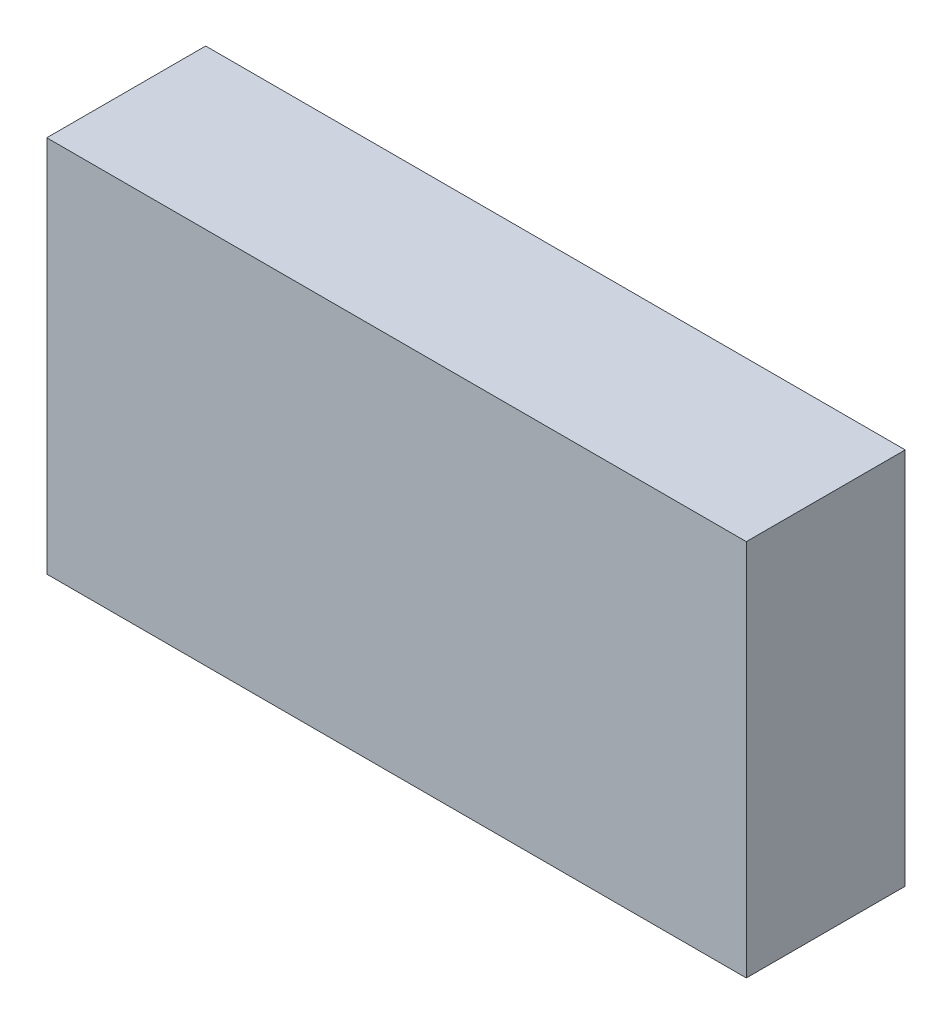
ISO-10303-21;
HEADER;
FILE_DESCRIPTION(('STEP AP214'),'2;1');
FILE_NAME('part.step','',(''),(''),'','','');
FILE_SCHEMA(('AUTOMOTIVE_DESIGN { 1 0 10303 214 1 1 1 1 }'));
ENDSEC;
DATA;
#1=APPLICATION_CONTEXT('core data for automotive mechanical design processes');
#2=APPLICATION_PROTOCOL_DEFINITION('international standard','automotive_design',2000,#1);
#3=PRODUCT_CONTEXT('',#1,'mechanical');
#4=PRODUCT('Part','Part','',(#3));
#5=PRODUCT_RELATED_PRODUCT_CATEGORY('part','',(#4));
#6=PRODUCT_DEFINITION_FORMATION('','',#4);
#7=PRODUCT_DEFINITION_CONTEXT('part definition',#1,'design');
#8=PRODUCT_DEFINITION('design','',#6,#7);
#9=PRODUCT_DEFINITION_SHAPE('','',#8);
#10=(LENGTH_UNIT() NAMED_UNIT(*) SI_UNIT(.MILLI.,.METRE.));
#11=(NAMED_UNIT(*) PLANE_ANGLE_UNIT() SI_UNIT($,.RADIAN.));
#12=(NAMED_UNIT(*) SI_UNIT($,.STERADIAN.) SOLID_ANGLE_UNIT());
#13=UNCERTAINTY_MEASURE_WITH_UNIT(LENGTH_MEASURE(1.E-05),#10,'distance_accuracy_value','');
#14=(GEOMETRIC_REPRESENTATION_CONTEXT(3) GLOBAL_UNCERTAINTY_ASSIGNED_CONTEXT((#13)) GLOBAL_UNIT_ASSIGNED_CONTEXT((#10,
#11,#12)) REPRESENTATION_CONTEXT('',''));
#15=CARTESIAN_POINT('',(0.,0.,0.));
#16=DIRECTION('',(0.,0.,1.));
#17=DIRECTION('',(1.,0.,0.));
#18=AXIS2_PLACEMENT_3D('',#15,#16,#17);
#19=CARTESIAN_POINT('',(7.48695755837089,12.934474149487,1.7018));
#20=DIRECTION('',(-1.,0.,0.));
#21=DIRECTION('',(0.,0.,1.));
#22=AXIS2_PLACEMENT_3D('',#19,#20,#21);
#23=PLANE('',#22);
#24=DIRECTION('',(0.,1.,0.));
#25=VECTOR('',#24,1.);
#26=CARTESIAN_POINT('',(7.48695755837089,12.458852617189,1.7018));
#27=LINE('',#26,#25);
#28=CARTESIAN_POINT('',(7.48695755837089,12.458852617189,1.7018));
#29=VERTEX_POINT('',#28);
#30=CARTESIAN_POINT('',(7.48695755837089,12.934474149487,1.7018));
#31=VERTEX_POINT('',#30);
#32=EDGE_CURVE('E115',#29,#31,#27,.T.);
#33=ORIENTED_EDGE('',*,*,#32,.F.);
#34=DIRECTION('',(0.,0.,1.));
#35=VECTOR('',#34,1.);
#36=CARTESIAN_POINT('',(7.48695755837089,12.458852617189,1.7018));
#37=LINE('',#36,#35);
#38=CARTESIAN_POINT('',(7.48695755837089,12.458852617189,1.9018));
#39=VERTEX_POINT('',#38);
#40=EDGE_CURVE('E67',#29,#39,#37,.T.);
#41=ORIENTED_EDGE('',*,*,#40,.T.);
#42=DIRECTION('',(0.,-1.,0.));
#43=VECTOR('',#42,1.);
#44=CARTESIAN_POINT('',(7.48695755837089,12.458852617189,1.9018));
#45=LINE('',#44,#43);
#46=CARTESIAN_POINT('',(7.48695755837089,12.934474149487,1.9018));
#47=VERTEX_POINT('',#46);
#48=EDGE_CURVE('E89',#47,#39,#45,.T.);
#49=ORIENTED_EDGE('',*,*,#48,.F.);
#50=DIRECTION('',(0.,0.,1.));
#51=VECTOR('',#50,1.);
#52=CARTESIAN_POINT('',(7.48695755837089,12.934474149487,1.7018));
#53=LINE('',#52,#51);
#54=EDGE_CURVE('E11',#31,#47,#53,.T.);
#55=ORIENTED_EDGE('',*,*,#54,.F.);
#56=EDGE_LOOP('',(#33,#41,#49,#55));
#57=FACE_BOUND('',#56,.T.);
#58=ADVANCED_FACE('F16',(#57),#23,.T.);
#59=CARTESIAN_POINT('',(8.36736337347557,12.934474149487,1.7018));
#60=DIRECTION('',(0.,1.,0.));
#61=DIRECTION('',(1.,0.,0.));
#62=AXIS2_PLACEMENT_3D('',#59,#60,#61);
#63=PLANE('',#62);
#64=DIRECTION('',(1.,0.,0.));
#65=VECTOR('',#64,1.);
#66=CARTESIAN_POINT('',(7.48695755837089,12.934474149487,1.7018));
#67=LINE('',#66,#65);
#68=CARTESIAN_POINT('',(8.36736337347557,12.934474149487,1.7018));
#69=VERTEX_POINT('',#68);
#70=EDGE_CURVE('E105',#31,#69,#67,.T.);
#71=ORIENTED_EDGE('',*,*,#70,.F.);
#72=ORIENTED_EDGE('',*,*,#54,.T.);
#73=DIRECTION('',(-1.,0.,0.));
#74=VECTOR('',#73,1.);
#75=CARTESIAN_POINT('',(7.48695755837089,12.934474149487,1.9018));
#76=LINE('',#75,#74);
#77=CARTESIAN_POINT('',(8.36736337347557,12.934474149487,1.9018));
#78=VERTEX_POINT('',#77);
#79=EDGE_CURVE('E97',#78,#47,#76,.T.);
#80=ORIENTED_EDGE('',*,*,#79,.F.);
#81=DIRECTION('',(0.,0.,1.));
#82=VECTOR('',#81,1.);
#83=CARTESIAN_POINT('',(8.36736337347557,12.934474149487,1.7018));
#84=LINE('',#83,#82);
#85=EDGE_CURVE('E27',#69,#78,#84,.T.);
#86=ORIENTED_EDGE('',*,*,#85,.F.);
#87=EDGE_LOOP('',(#71,#72,#80,#86));
#88=FACE_BOUND('',#87,.T.);
#89=ADVANCED_FACE('F126',(#88),#63,.T.);
#90=CARTESIAN_POINT('',(8.36736337347557,12.458852617189,1.7018));
#91=DIRECTION('',(1.,0.,0.));
#92=DIRECTION('',(0.,1.,0.));
#93=AXIS2_PLACEMENT_3D('',#90,#91,#92);
#94=PLANE('',#93);
#95=DIRECTION('',(0.,-1.,0.));
#96=VECTOR('',#95,1.);
#97=CARTESIAN_POINT('',(8.36736337347557,12.934474149487,1.7018));
#98=LINE('',#97,#96);
#99=CARTESIAN_POINT('',(8.36736337347557,12.458852617189,1.7018));
#100=VERTEX_POINT('',#99);
#101=EDGE_CURVE('E20',#69,#100,#98,.T.);
#102=ORIENTED_EDGE('',*,*,#101,.F.);
#103=ORIENTED_EDGE('',*,*,#85,.T.);
#104=DIRECTION('',(0.,1.,0.));
#105=VECTOR('',#104,1.);
#106=CARTESIAN_POINT('',(8.36736337347557,12.934474149487,1.9018));
#107=LINE('',#106,#105);
#108=CARTESIAN_POINT('',(8.36736337347557,12.458852617189,1.9018));
#109=VERTEX_POINT('',#108);
#110=EDGE_CURVE('E92',#109,#78,#107,.T.);
#111=ORIENTED_EDGE('',*,*,#110,.F.);
#112=DIRECTION('',(0.,0.,1.));
#113=VECTOR('',#112,1.);
#114=CARTESIAN_POINT('',(8.36736337347557,12.458852617189,1.7018));
#115=LINE('',#114,#113);
#116=EDGE_CURVE('E78',#100,#109,#115,.T.);
#117=ORIENTED_EDGE('',*,*,#116,.F.);
#118=EDGE_LOOP('',(#102,#103,#111,#117));
#119=FACE_BOUND('',#118,.T.);
#120=ADVANCED_FACE('F93',(#119),#94,.T.);
#121=CARTESIAN_POINT('',(7.48695755837089,12.458852617189,1.7018));
#122=DIRECTION('',(0.,-1.,0.));
#123=DIRECTION('',(0.,0.,-1.));
#124=AXIS2_PLACEMENT_3D('',#121,#122,#123);
#125=PLANE('',#124);
#126=DIRECTION('',(-1.,0.,0.));
#127=VECTOR('',#126,1.);
#128=CARTESIAN_POINT('',(8.36736337347557,12.458852617189,1.7018));
#129=LINE('',#128,#127);
#130=EDGE_CURVE('E84',#100,#29,#129,.T.);
#131=ORIENTED_EDGE('',*,*,#130,.F.);
#132=ORIENTED_EDGE('',*,*,#116,.T.);
#133=DIRECTION('',(1.,0.,0.));
#134=VECTOR('',#133,1.);
#135=CARTESIAN_POINT('',(8.36736337347557,12.458852617189,1.9018));
#136=LINE('',#135,#134);
#137=EDGE_CURVE('E82',#39,#109,#136,.T.);
#138=ORIENTED_EDGE('',*,*,#137,.F.);
#139=ORIENTED_EDGE('',*,*,#40,.F.);
#140=EDGE_LOOP('',(#131,#132,#138,#139));
#141=FACE_BOUND('',#140,.T.);
#142=ADVANCED_FACE('F80',(#141),#125,.T.);
#143=CARTESIAN_POINT('',(7.92716046592323,12.696663383338,1.9018));
#144=DIRECTION('',(0.,0.,1.));
#145=DIRECTION('',(1.,0.,0.));
#146=AXIS2_PLACEMENT_3D('',#143,#144,#145);
#147=PLANE('',#146);
#148=ORIENTED_EDGE('',*,*,#137,.T.);
#149=ORIENTED_EDGE('',*,*,#110,.T.);
#150=ORIENTED_EDGE('',*,*,#79,.T.);
#151=ORIENTED_EDGE('',*,*,#48,.T.);
#152=EDGE_LOOP('',(#148,#149,#150,#151));
#153=FACE_BOUND('',#152,.T.);
#154=ADVANCED_FACE('F18',(#153),#147,.T.);
#155=CARTESIAN_POINT('',(7.92716046592323,12.696663383338,1.7018));
#156=DIRECTION('',(0.,0.,1.));
#157=DIRECTION('',(1.,0.,0.));
#158=AXIS2_PLACEMENT_3D('',#155,#156,#157);
#159=PLANE('',#158);
#160=ORIENTED_EDGE('',*,*,#130,.T.);
#161=ORIENTED_EDGE('',*,*,#32,.T.);
#162=ORIENTED_EDGE('',*,*,#70,.T.);
#163=ORIENTED_EDGE('',*,*,#101,.T.);
#164=EDGE_LOOP('',(#160,#161,#162,#163));
#165=FACE_BOUND('',#164,.T.);
#166=ADVANCED_FACE('F124',(#165),#159,.F.);
#167=CLOSED_SHELL('',(#58,#89,#120,#142,#154,#166));
#168=MANIFOLD_SOLID_BREP('B1',#167);
#169=ADVANCED_BREP_SHAPE_REPRESENTATION('',(#18,#168),#14);
#170=SHAPE_DEFINITION_REPRESENTATION(#9,#169);
ENDSEC;
END-ISO-10303-21;
